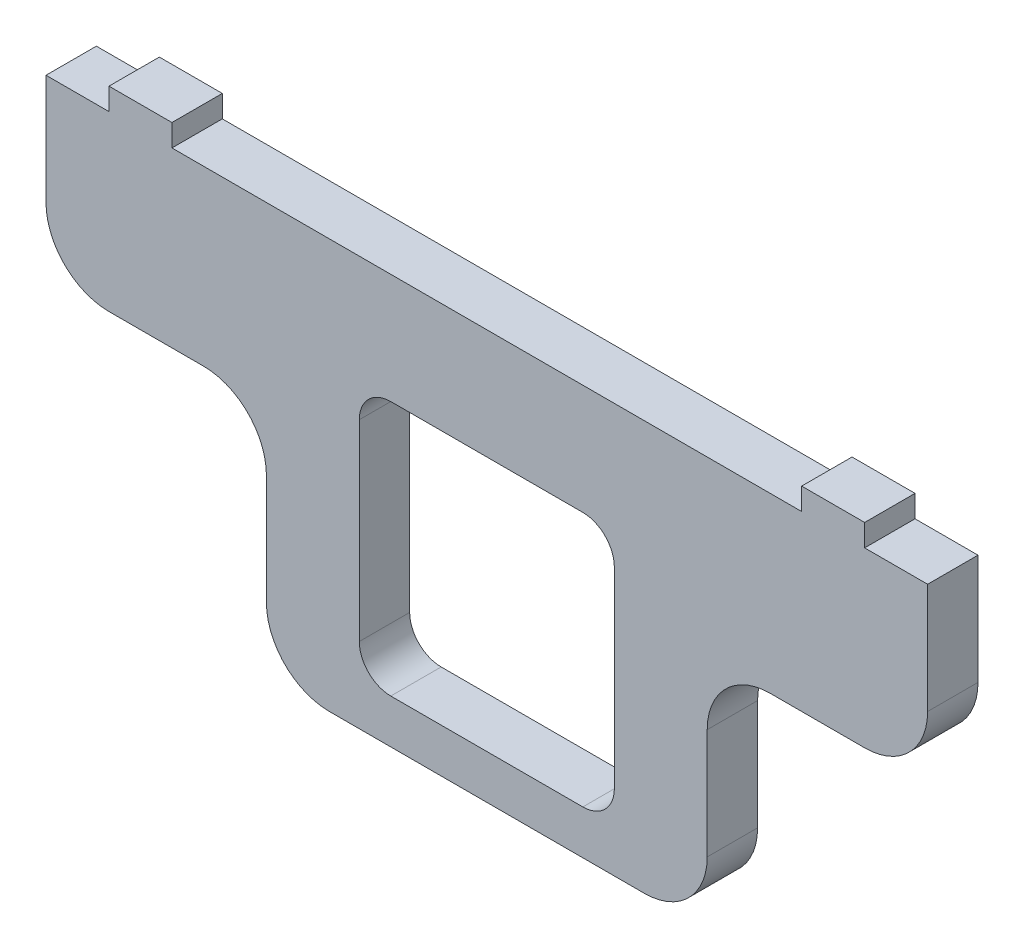
ISO-10303-21;
HEADER;
FILE_DESCRIPTION(('STEP AP214'),'2;1');
FILE_NAME('part.step','',(''),(''),'','','');
FILE_SCHEMA(('AUTOMOTIVE_DESIGN { 1 0 10303 214 1 1 1 1 }'));
ENDSEC;
DATA;
#1=APPLICATION_CONTEXT('core data for automotive mechanical design processes');
#2=APPLICATION_PROTOCOL_DEFINITION('international standard','automotive_design',2000,#1);
#3=PRODUCT_CONTEXT('',#1,'mechanical');
#4=PRODUCT('Part','Part','',(#3));
#5=PRODUCT_RELATED_PRODUCT_CATEGORY('part','',(#4));
#6=PRODUCT_DEFINITION_FORMATION('','',#4);
#7=PRODUCT_DEFINITION_CONTEXT('part definition',#1,'design');
#8=PRODUCT_DEFINITION('design','',#6,#7);
#9=PRODUCT_DEFINITION_SHAPE('','',#8);
#10=(LENGTH_UNIT() NAMED_UNIT(*) SI_UNIT(.MILLI.,.METRE.));
#11=(NAMED_UNIT(*) PLANE_ANGLE_UNIT() SI_UNIT($,.RADIAN.));
#12=(NAMED_UNIT(*) SI_UNIT($,.STERADIAN.) SOLID_ANGLE_UNIT());
#13=UNCERTAINTY_MEASURE_WITH_UNIT(LENGTH_MEASURE(1.E-05),#10,'distance_accuracy_value','');
#14=(GEOMETRIC_REPRESENTATION_CONTEXT(3) GLOBAL_UNCERTAINTY_ASSIGNED_CONTEXT((#13)) GLOBAL_UNIT_ASSIGNED_CONTEXT((#10,
#11,#12)) REPRESENTATION_CONTEXT('',''));
#15=CARTESIAN_POINT('',(0.,0.,0.));
#16=DIRECTION('',(0.,0.,1.));
#17=DIRECTION('',(1.,0.,0.));
#18=AXIS2_PLACEMENT_3D('',#15,#16,#17);
#19=CARTESIAN_POINT('',(0.,0.,8.));
#20=DIRECTION('',(0.,0.,-1.));
#21=DIRECTION('',(-1.,0.,0.));
#22=AXIS2_PLACEMENT_3D('',#19,#20,#21);
#23=PLANE('',#22);
#24=DIRECTION('',(1.,0.,0.));
#25=VECTOR('',#24,1.);
#26=CARTESIAN_POINT('',(70.,75.,8.));
#27=LINE('',#26,#25);
#28=CARTESIAN_POINT('',(90.,75.,8.));
#29=VERTEX_POINT('',#28);
#30=CARTESIAN_POINT('',(120.,75.,8.));
#31=VERTEX_POINT('',#30);
#32=EDGE_CURVE('E241',#29,#31,#27,.T.);
#33=ORIENTED_EDGE('',*,*,#32,.T.);
#34=CARTESIAN_POINT('',(120.,95.,8.));
#35=DIRECTION('',(0.,0.,-1.));
#36=DIRECTION('',(-1.,0.,0.));
#37=AXIS2_PLACEMENT_3D('',#34,#35,#36);
#38=CIRCLE('',#37,20.);
#39=CARTESIAN_POINT('',(140.,95.,8.));
#40=VERTEX_POINT('',#39);
#41=EDGE_CURVE('E237',#31,#40,#38,.F.);
#42=ORIENTED_EDGE('',*,*,#41,.T.);
#43=DIRECTION('',(0.,1.,0.));
#44=VECTOR('',#43,1.);
#45=CARTESIAN_POINT('',(140.,75.,8.));
#46=LINE('',#45,#44);
#47=CARTESIAN_POINT('',(140.,130.,8.));
#48=VERTEX_POINT('',#47);
#49=EDGE_CURVE('E230',#40,#48,#46,.T.);
#50=ORIENTED_EDGE('',*,*,#49,.T.);
#51=DIRECTION('',(-1.,0.,0.));
#52=VECTOR('',#51,1.);
#53=CARTESIAN_POINT('',(140.,130.,8.));
#54=LINE('',#53,#52);
#55=CARTESIAN_POINT('',(120.,130.,8.));
#56=VERTEX_POINT('',#55);
#57=EDGE_CURVE('E234',#48,#56,#54,.T.);
#58=ORIENTED_EDGE('',*,*,#57,.T.);
#59=DIRECTION('',(0.,1.,0.));
#60=VECTOR('',#59,1.);
#61=CARTESIAN_POINT('',(120.,130.,8.));
#62=LINE('',#61,#60);
#63=CARTESIAN_POINT('',(120.,137.,8.));
#64=VERTEX_POINT('',#63);
#65=EDGE_CURVE('E256',#56,#64,#62,.T.);
#66=ORIENTED_EDGE('',*,*,#65,.T.);
#67=DIRECTION('',(-1.,0.,0.));
#68=VECTOR('',#67,1.);
#69=CARTESIAN_POINT('',(120.,137.,8.));
#70=LINE('',#69,#68);
#71=CARTESIAN_POINT('',(100.,137.,8.));
#72=VERTEX_POINT('',#71);
#73=EDGE_CURVE('E258',#64,#72,#70,.T.);
#74=ORIENTED_EDGE('',*,*,#73,.T.);
#75=DIRECTION('',(0.,-1.,0.));
#76=VECTOR('',#75,1.);
#77=CARTESIAN_POINT('',(100.,137.,8.));
#78=LINE('',#77,#76);
#79=CARTESIAN_POINT('',(100.,130.,8.));
#80=VERTEX_POINT('',#79);
#81=EDGE_CURVE('E263',#72,#80,#78,.T.);
#82=ORIENTED_EDGE('',*,*,#81,.T.);
#83=DIRECTION('',(-1.,0.,0.));
#84=VECTOR('',#83,1.);
#85=CARTESIAN_POINT('',(100.,130.,8.));
#86=LINE('',#85,#84);
#87=CARTESIAN_POINT('',(-100.,130.,8.));
#88=VERTEX_POINT('',#87);
#89=EDGE_CURVE('E265',#80,#88,#86,.T.);
#90=ORIENTED_EDGE('',*,*,#89,.T.);
#91=DIRECTION('',(0.,1.,0.));
#92=VECTOR('',#91,1.);
#93=CARTESIAN_POINT('',(-100.,137.,8.));
#94=LINE('',#93,#92);
#95=CARTESIAN_POINT('',(-100.,137.,8.));
#96=VERTEX_POINT('',#95);
#97=EDGE_CURVE('E267',#88,#96,#94,.T.);
#98=ORIENTED_EDGE('',*,*,#97,.T.);
#99=DIRECTION('',(-1.,0.,0.));
#100=VECTOR('',#99,1.);
#101=CARTESIAN_POINT('',(-120.,137.,8.));
#102=LINE('',#101,#100);
#103=CARTESIAN_POINT('',(-120.,137.,8.));
#104=VERTEX_POINT('',#103);
#105=EDGE_CURVE('E269',#96,#104,#102,.T.);
#106=ORIENTED_EDGE('',*,*,#105,.T.);
#107=DIRECTION('',(0.,-1.,0.));
#108=VECTOR('',#107,1.);
#109=CARTESIAN_POINT('',(-120.,130.,8.));
#110=LINE('',#109,#108);
#111=CARTESIAN_POINT('',(-120.,130.,8.));
#112=VERTEX_POINT('',#111);
#113=EDGE_CURVE('E271',#104,#112,#110,.T.);
#114=ORIENTED_EDGE('',*,*,#113,.T.);
#115=DIRECTION('',(-1.,0.,0.));
#116=VECTOR('',#115,1.);
#117=CARTESIAN_POINT('',(-140.,130.,8.));
#118=LINE('',#117,#116);
#119=CARTESIAN_POINT('',(-140.,130.,8.));
#120=VERTEX_POINT('',#119);
#121=EDGE_CURVE('E273',#112,#120,#118,.T.);
#122=ORIENTED_EDGE('',*,*,#121,.T.);
#123=DIRECTION('',(0.,-1.,0.));
#124=VECTOR('',#123,1.);
#125=CARTESIAN_POINT('',(-140.,75.,8.));
#126=LINE('',#125,#124);
#127=CARTESIAN_POINT('',(-140.,95.,8.));
#128=VERTEX_POINT('',#127);
#129=EDGE_CURVE('E275',#120,#128,#126,.T.);
#130=ORIENTED_EDGE('',*,*,#129,.T.);
#131=CARTESIAN_POINT('',(-120.,95.,8.));
#132=DIRECTION('',(0.,0.,-1.));
#133=DIRECTION('',(-1.,0.,0.));
#134=AXIS2_PLACEMENT_3D('',#131,#132,#133);
#135=CIRCLE('',#134,20.);
#136=CARTESIAN_POINT('',(-120.,75.,8.));
#137=VERTEX_POINT('',#136);
#138=EDGE_CURVE('E369',#128,#137,#135,.F.);
#139=ORIENTED_EDGE('',*,*,#138,.T.);
#140=DIRECTION('',(1.,0.,0.));
#141=VECTOR('',#140,1.);
#142=CARTESIAN_POINT('',(-70.,75.,8.));
#143=LINE('',#142,#141);
#144=CARTESIAN_POINT('',(-90.,75.,8.));
#145=VERTEX_POINT('',#144);
#146=EDGE_CURVE('E278',#137,#145,#143,.T.);
#147=ORIENTED_EDGE('',*,*,#146,.T.);
#148=CARTESIAN_POINT('',(-90.,55.,8.));
#149=DIRECTION('',(0.,0.,-1.));
#150=DIRECTION('',(-1.,0.,0.));
#151=AXIS2_PLACEMENT_3D('',#148,#149,#150);
#152=CIRCLE('',#151,20.);
#153=CARTESIAN_POINT('',(-70.,55.,8.));
#154=VERTEX_POINT('',#153);
#155=EDGE_CURVE('E400',#145,#154,#152,.T.);
#156=ORIENTED_EDGE('',*,*,#155,.T.);
#157=DIRECTION('',(0.,-1.,0.));
#158=VECTOR('',#157,1.);
#159=CARTESIAN_POINT('',(-70.,0.,8.));
#160=LINE('',#159,#158);
#161=CARTESIAN_POINT('',(-70.,20.,8.));
#162=VERTEX_POINT('',#161);
#163=EDGE_CURVE('E281',#154,#162,#160,.T.);
#164=ORIENTED_EDGE('',*,*,#163,.T.);
#165=CARTESIAN_POINT('',(-50.,20.,8.));
#166=DIRECTION('',(0.,0.,-1.));
#167=DIRECTION('',(-1.,0.,0.));
#168=AXIS2_PLACEMENT_3D('',#165,#166,#167);
#169=CIRCLE('',#168,20.);
#170=CARTESIAN_POINT('',(-50.,0.,8.));
#171=VERTEX_POINT('',#170);
#172=EDGE_CURVE('E365',#162,#171,#169,.F.);
#173=ORIENTED_EDGE('',*,*,#172,.T.);
#174=DIRECTION('',(1.,0.,0.));
#175=VECTOR('',#174,1.);
#176=CARTESIAN_POINT('',(-70.,0.,8.));
#177=LINE('',#176,#175);
#178=CARTESIAN_POINT('',(50.,0.,8.));
#179=VERTEX_POINT('',#178);
#180=EDGE_CURVE('E284',#171,#179,#177,.T.);
#181=ORIENTED_EDGE('',*,*,#180,.T.);
#182=CARTESIAN_POINT('',(50.,20.,8.));
#183=DIRECTION('',(0.,0.,-1.));
#184=DIRECTION('',(-1.,0.,0.));
#185=AXIS2_PLACEMENT_3D('',#182,#183,#184);
#186=CIRCLE('',#185,20.);
#187=CARTESIAN_POINT('',(70.,20.,8.));
#188=VERTEX_POINT('',#187);
#189=EDGE_CURVE('E367',#179,#188,#186,.F.);
#190=ORIENTED_EDGE('',*,*,#189,.T.);
#191=DIRECTION('',(0.,1.,0.));
#192=VECTOR('',#191,1.);
#193=CARTESIAN_POINT('',(70.,0.,8.));
#194=LINE('',#193,#192);
#195=CARTESIAN_POINT('',(70.,55.,8.));
#196=VERTEX_POINT('',#195);
#197=EDGE_CURVE('E326',#188,#196,#194,.T.);
#198=ORIENTED_EDGE('',*,*,#197,.T.);
#199=CARTESIAN_POINT('',(90.,55.,8.));
#200=DIRECTION('',(0.,0.,-1.));
#201=DIRECTION('',(-1.,0.,0.));
#202=AXIS2_PLACEMENT_3D('',#199,#200,#201);
#203=CIRCLE('',#202,20.);
#204=EDGE_CURVE('E396',#196,#29,#203,.T.);
#205=ORIENTED_EDGE('',*,*,#204,.T.);
#206=EDGE_LOOP('',(#33,#42,#50,#58,#66,#74,#82,#90,#98,#106,#114,#122,#130,#139,#147,#156,#164,
#173,#181,#190,#198,#205));
#207=FACE_BOUND('',#206,.T.);
#208=DIRECTION('',(0.,-1.,0.));
#209=VECTOR('',#208,1.);
#210=CARTESIAN_POINT('',(-40.5,95.,8.));
#211=LINE('',#210,#209);
#212=CARTESIAN_POINT('',(-40.5,85.,8.));
#213=VERTEX_POINT('',#212);
#214=CARTESIAN_POINT('',(-40.5,24.,8.));
#215=VERTEX_POINT('',#214);
#216=EDGE_CURVE('E463',#213,#215,#211,.T.);
#217=ORIENTED_EDGE('',*,*,#216,.F.);
#218=CARTESIAN_POINT('',(-30.5,85.,8.));
#219=DIRECTION('',(0.,0.,-1.));
#220=DIRECTION('',(-1.,0.,0.));
#221=AXIS2_PLACEMENT_3D('',#218,#219,#220);
#222=CIRCLE('',#221,10.);
#223=CARTESIAN_POINT('',(-30.5,95.,8.));
#224=VERTEX_POINT('',#223);
#225=EDGE_CURVE('E11',#213,#224,#222,.T.);
#226=ORIENTED_EDGE('',*,*,#225,.T.);
#227=DIRECTION('',(-1.,0.,0.));
#228=VECTOR('',#227,1.);
#229=CARTESIAN_POINT('',(-40.5,95.,8.));
#230=LINE('',#229,#228);
#231=CARTESIAN_POINT('',(30.5,95.,8.));
#232=VERTEX_POINT('',#231);
#233=EDGE_CURVE('E292',#232,#224,#230,.T.);
#234=ORIENTED_EDGE('',*,*,#233,.F.);
#235=CARTESIAN_POINT('',(30.5,85.,8.));
#236=DIRECTION('',(0.,0.,-1.));
#237=DIRECTION('',(-1.,0.,0.));
#238=AXIS2_PLACEMENT_3D('',#235,#236,#237);
#239=CIRCLE('',#238,10.);
#240=CARTESIAN_POINT('',(40.5,85.,8.));
#241=VERTEX_POINT('',#240);
#242=EDGE_CURVE('E431',#232,#241,#239,.T.);
#243=ORIENTED_EDGE('',*,*,#242,.T.);
#244=DIRECTION('',(0.,1.,0.));
#245=VECTOR('',#244,1.);
#246=CARTESIAN_POINT('',(40.5,95.,8.));
#247=LINE('',#246,#245);
#248=CARTESIAN_POINT('',(40.5,24.,8.));
#249=VERTEX_POINT('',#248);
#250=EDGE_CURVE('E451',#249,#241,#247,.T.);
#251=ORIENTED_EDGE('',*,*,#250,.F.);
#252=CARTESIAN_POINT('',(30.5,24.,8.));
#253=DIRECTION('',(0.,0.,-1.));
#254=DIRECTION('',(-1.,0.,0.));
#255=AXIS2_PLACEMENT_3D('',#252,#253,#254);
#256=CIRCLE('',#255,10.);
#257=CARTESIAN_POINT('',(30.5,14.,8.));
#258=VERTEX_POINT('',#257);
#259=EDGE_CURVE('E423',#249,#258,#256,.T.);
#260=ORIENTED_EDGE('',*,*,#259,.T.);
#261=DIRECTION('',(1.,0.,0.));
#262=VECTOR('',#261,1.);
#263=CARTESIAN_POINT('',(40.5,14.,8.));
#264=LINE('',#263,#262);
#265=CARTESIAN_POINT('',(-30.5,14.,8.));
#266=VERTEX_POINT('',#265);
#267=EDGE_CURVE('E454',#266,#258,#264,.T.);
#268=ORIENTED_EDGE('',*,*,#267,.F.);
#269=CARTESIAN_POINT('',(-30.5,24.,8.));
#270=DIRECTION('',(0.,0.,-1.));
#271=DIRECTION('',(-1.,0.,0.));
#272=AXIS2_PLACEMENT_3D('',#269,#270,#271);
#273=CIRCLE('',#272,10.);
#274=EDGE_CURVE('E427',#266,#215,#273,.T.);
#275=ORIENTED_EDGE('',*,*,#274,.T.);
#276=EDGE_LOOP('',(#217,#226,#234,#243,#251,#260,#268,#275));
#277=FACE_BOUND('',#276,.T.);
#278=ADVANCED_FACE('F34',(#207,#277),#23,.F.);
#279=CARTESIAN_POINT('',(0.,0.,-8.));
#280=DIRECTION('',(0.,0.,-1.));
#281=DIRECTION('',(-1.,0.,0.));
#282=AXIS2_PLACEMENT_3D('',#279,#280,#281);
#283=PLANE('',#282);
#284=DIRECTION('',(0.,1.,0.));
#285=VECTOR('',#284,1.);
#286=CARTESIAN_POINT('',(140.,75.,-8.));
#287=LINE('',#286,#285);
#288=CARTESIAN_POINT('',(140.,95.,-8.));
#289=VERTEX_POINT('',#288);
#290=CARTESIAN_POINT('',(140.,130.,-8.));
#291=VERTEX_POINT('',#290);
#292=EDGE_CURVE('E247',#289,#291,#287,.T.);
#293=ORIENTED_EDGE('',*,*,#292,.F.);
#294=CARTESIAN_POINT('',(120.,95.,-8.));
#295=DIRECTION('',(0.,0.,-1.));
#296=DIRECTION('',(-1.,0.,0.));
#297=AXIS2_PLACEMENT_3D('',#294,#295,#296);
#298=CIRCLE('',#297,20.);
#299=CARTESIAN_POINT('',(120.,75.,-8.));
#300=VERTEX_POINT('',#299);
#301=EDGE_CURVE('E358',#289,#300,#298,.T.);
#302=ORIENTED_EDGE('',*,*,#301,.T.);
#303=DIRECTION('',(1.,0.,0.));
#304=VECTOR('',#303,1.);
#305=CARTESIAN_POINT('',(70.,75.,-8.));
#306=LINE('',#305,#304);
#307=CARTESIAN_POINT('',(90.,75.,-8.));
#308=VERTEX_POINT('',#307);
#309=EDGE_CURVE('E291',#308,#300,#306,.T.);
#310=ORIENTED_EDGE('',*,*,#309,.F.);
#311=CARTESIAN_POINT('',(90.,55.,-8.));
#312=DIRECTION('',(0.,0.,-1.));
#313=DIRECTION('',(-1.,0.,0.));
#314=AXIS2_PLACEMENT_3D('',#311,#312,#313);
#315=CIRCLE('',#314,20.);
#316=CARTESIAN_POINT('',(70.,55.,-8.));
#317=VERTEX_POINT('',#316);
#318=EDGE_CURVE('E394',#308,#317,#315,.F.);
#319=ORIENTED_EDGE('',*,*,#318,.T.);
#320=DIRECTION('',(0.,1.,0.));
#321=VECTOR('',#320,1.);
#322=CARTESIAN_POINT('',(70.,0.,-8.));
#323=LINE('',#322,#321);
#324=CARTESIAN_POINT('',(70.,20.,-8.));
#325=VERTEX_POINT('',#324);
#326=EDGE_CURVE('E288',#325,#317,#323,.T.);
#327=ORIENTED_EDGE('',*,*,#326,.F.);
#328=CARTESIAN_POINT('',(50.,20.,-8.));
#329=DIRECTION('',(0.,0.,-1.));
#330=DIRECTION('',(-1.,0.,0.));
#331=AXIS2_PLACEMENT_3D('',#328,#329,#330);
#332=CIRCLE('',#331,20.);
#333=CARTESIAN_POINT('',(50.,0.,-8.));
#334=VERTEX_POINT('',#333);
#335=EDGE_CURVE('E354',#325,#334,#332,.T.);
#336=ORIENTED_EDGE('',*,*,#335,.T.);
#337=DIRECTION('',(1.,0.,0.));
#338=VECTOR('',#337,1.);
#339=CARTESIAN_POINT('',(-70.,0.,-8.));
#340=LINE('',#339,#338);
#341=CARTESIAN_POINT('',(-50.,0.,-8.));
#342=VERTEX_POINT('',#341);
#343=EDGE_CURVE('E323',#342,#334,#340,.T.);
#344=ORIENTED_EDGE('',*,*,#343,.F.);
#345=CARTESIAN_POINT('',(-50.,20.,-8.));
#346=DIRECTION('',(0.,0.,-1.));
#347=DIRECTION('',(-1.,0.,0.));
#348=AXIS2_PLACEMENT_3D('',#345,#346,#347);
#349=CIRCLE('',#348,20.);
#350=CARTESIAN_POINT('',(-70.,20.,-8.));
#351=VERTEX_POINT('',#350);
#352=EDGE_CURVE('E352',#342,#351,#349,.T.);
#353=ORIENTED_EDGE('',*,*,#352,.T.);
#354=DIRECTION('',(0.,-1.,0.));
#355=VECTOR('',#354,1.);
#356=CARTESIAN_POINT('',(-70.,0.,-8.));
#357=LINE('',#356,#355);
#358=CARTESIAN_POINT('',(-70.,55.,-8.));
#359=VERTEX_POINT('',#358);
#360=EDGE_CURVE('E320',#359,#351,#357,.T.);
#361=ORIENTED_EDGE('',*,*,#360,.F.);
#362=CARTESIAN_POINT('',(-90.,55.,-8.));
#363=DIRECTION('',(0.,0.,-1.));
#364=DIRECTION('',(-1.,0.,0.));
#365=AXIS2_PLACEMENT_3D('',#362,#363,#364);
#366=CIRCLE('',#365,20.);
#367=CARTESIAN_POINT('',(-90.,75.,-8.));
#368=VERTEX_POINT('',#367);
#369=EDGE_CURVE('E398',#359,#368,#366,.F.);
#370=ORIENTED_EDGE('',*,*,#369,.T.);
#371=DIRECTION('',(1.,0.,0.));
#372=VECTOR('',#371,1.);
#373=CARTESIAN_POINT('',(-70.,75.,-8.));
#374=LINE('',#373,#372);
#375=CARTESIAN_POINT('',(-120.,75.,-8.));
#376=VERTEX_POINT('',#375);
#377=EDGE_CURVE('E317',#376,#368,#374,.T.);
#378=ORIENTED_EDGE('',*,*,#377,.F.);
#379=CARTESIAN_POINT('',(-120.,95.,-8.));
#380=DIRECTION('',(0.,0.,-1.));
#381=DIRECTION('',(-1.,0.,0.));
#382=AXIS2_PLACEMENT_3D('',#379,#380,#381);
#383=CIRCLE('',#382,20.);
#384=CARTESIAN_POINT('',(-140.,95.,-8.));
#385=VERTEX_POINT('',#384);
#386=EDGE_CURVE('E356',#376,#385,#383,.T.);
#387=ORIENTED_EDGE('',*,*,#386,.T.);
#388=DIRECTION('',(0.,-1.,0.));
#389=VECTOR('',#388,1.);
#390=CARTESIAN_POINT('',(-140.,75.,-8.));
#391=LINE('',#390,#389);
#392=CARTESIAN_POINT('',(-140.,130.,-8.));
#393=VERTEX_POINT('',#392);
#394=EDGE_CURVE('E314',#393,#385,#391,.T.);
#395=ORIENTED_EDGE('',*,*,#394,.F.);
#396=DIRECTION('',(-1.,0.,0.));
#397=VECTOR('',#396,1.);
#398=CARTESIAN_POINT('',(-140.,130.,-8.));
#399=LINE('',#398,#397);
#400=CARTESIAN_POINT('',(-120.,130.,-8.));
#401=VERTEX_POINT('',#400);
#402=EDGE_CURVE('E312',#401,#393,#399,.T.);
#403=ORIENTED_EDGE('',*,*,#402,.F.);
#404=DIRECTION('',(0.,-1.,0.));
#405=VECTOR('',#404,1.);
#406=CARTESIAN_POINT('',(-120.,130.,-8.));
#407=LINE('',#406,#405);
#408=CARTESIAN_POINT('',(-120.,137.,-8.));
#409=VERTEX_POINT('',#408);
#410=EDGE_CURVE('E310',#409,#401,#407,.T.);
#411=ORIENTED_EDGE('',*,*,#410,.F.);
#412=DIRECTION('',(-1.,0.,0.));
#413=VECTOR('',#412,1.);
#414=CARTESIAN_POINT('',(-120.,137.,-8.));
#415=LINE('',#414,#413);
#416=CARTESIAN_POINT('',(-100.,137.,-8.));
#417=VERTEX_POINT('',#416);
#418=EDGE_CURVE('E308',#417,#409,#415,.T.);
#419=ORIENTED_EDGE('',*,*,#418,.F.);
#420=DIRECTION('',(0.,1.,0.));
#421=VECTOR('',#420,1.);
#422=CARTESIAN_POINT('',(-100.,137.,-8.));
#423=LINE('',#422,#421);
#424=CARTESIAN_POINT('',(-100.,130.,-8.));
#425=VERTEX_POINT('',#424);
#426=EDGE_CURVE('E306',#425,#417,#423,.T.);
#427=ORIENTED_EDGE('',*,*,#426,.F.);
#428=DIRECTION('',(-1.,0.,0.));
#429=VECTOR('',#428,1.);
#430=CARTESIAN_POINT('',(100.,130.,-8.));
#431=LINE('',#430,#429);
#432=CARTESIAN_POINT('',(100.,130.,-8.));
#433=VERTEX_POINT('',#432);
#434=EDGE_CURVE('E304',#433,#425,#431,.T.);
#435=ORIENTED_EDGE('',*,*,#434,.F.);
#436=DIRECTION('',(0.,-1.,0.));
#437=VECTOR('',#436,1.);
#438=CARTESIAN_POINT('',(100.,137.,-8.));
#439=LINE('',#438,#437);
#440=CARTESIAN_POINT('',(100.,137.,-8.));
#441=VERTEX_POINT('',#440);
#442=EDGE_CURVE('E302',#441,#433,#439,.T.);
#443=ORIENTED_EDGE('',*,*,#442,.F.);
#444=DIRECTION('',(-1.,0.,0.));
#445=VECTOR('',#444,1.);
#446=CARTESIAN_POINT('',(120.,137.,-8.));
#447=LINE('',#446,#445);
#448=CARTESIAN_POINT('',(120.,137.,-8.));
#449=VERTEX_POINT('',#448);
#450=EDGE_CURVE('E300',#449,#441,#447,.T.);
#451=ORIENTED_EDGE('',*,*,#450,.F.);
#452=DIRECTION('',(0.,1.,0.));
#453=VECTOR('',#452,1.);
#454=CARTESIAN_POINT('',(120.,130.,-8.));
#455=LINE('',#454,#453);
#456=CARTESIAN_POINT('',(120.,130.,-8.));
#457=VERTEX_POINT('',#456);
#458=EDGE_CURVE('E298',#457,#449,#455,.T.);
#459=ORIENTED_EDGE('',*,*,#458,.F.);
#460=DIRECTION('',(-1.,0.,0.));
#461=VECTOR('',#460,1.);
#462=CARTESIAN_POINT('',(140.,130.,-8.));
#463=LINE('',#462,#461);
#464=EDGE_CURVE('E296',#291,#457,#463,.T.);
#465=ORIENTED_EDGE('',*,*,#464,.F.);
#466=EDGE_LOOP('',(#293,#302,#310,#319,#327,#336,#344,#353,#361,#370,#378,#387,#395,#403,#411,
#419,#427,#435,#443,#451,#459,#465));
#467=FACE_BOUND('',#466,.T.);
#468=DIRECTION('',(0.,1.,0.));
#469=VECTOR('',#468,1.);
#470=CARTESIAN_POINT('',(40.5,95.,-8.));
#471=LINE('',#470,#469);
#472=CARTESIAN_POINT('',(40.5,24.,-8.));
#473=VERTEX_POINT('',#472);
#474=CARTESIAN_POINT('',(40.5,85.,-8.));
#475=VERTEX_POINT('',#474);
#476=EDGE_CURVE('E460',#473,#475,#471,.T.);
#477=ORIENTED_EDGE('',*,*,#476,.T.);
#478=CARTESIAN_POINT('',(30.5,85.,-8.));
#479=DIRECTION('',(0.,0.,-1.));
#480=DIRECTION('',(-1.,0.,0.));
#481=AXIS2_PLACEMENT_3D('',#478,#479,#480);
#482=CIRCLE('',#481,10.);
#483=CARTESIAN_POINT('',(30.5,95.,-8.));
#484=VERTEX_POINT('',#483);
#485=EDGE_CURVE('E429',#475,#484,#482,.F.);
#486=ORIENTED_EDGE('',*,*,#485,.T.);
#487=DIRECTION('',(-1.,0.,0.));
#488=VECTOR('',#487,1.);
#489=CARTESIAN_POINT('',(-40.5,95.,-8.));
#490=LINE('',#489,#488);
#491=CARTESIAN_POINT('',(-30.5,95.,-8.));
#492=VERTEX_POINT('',#491);
#493=EDGE_CURVE('E439',#484,#492,#490,.T.);
#494=ORIENTED_EDGE('',*,*,#493,.T.);
#495=CARTESIAN_POINT('',(-30.5,85.,-8.));
#496=DIRECTION('',(0.,0.,-1.));
#497=DIRECTION('',(-1.,0.,0.));
#498=AXIS2_PLACEMENT_3D('',#495,#496,#497);
#499=CIRCLE('',#498,10.);
#500=CARTESIAN_POINT('',(-40.5,85.,-8.));
#501=VERTEX_POINT('',#500);
#502=EDGE_CURVE('E42',#492,#501,#499,.F.);
#503=ORIENTED_EDGE('',*,*,#502,.T.);
#504=DIRECTION('',(0.,-1.,0.));
#505=VECTOR('',#504,1.);
#506=CARTESIAN_POINT('',(-40.5,95.,-8.));
#507=LINE('',#506,#505);
#508=CARTESIAN_POINT('',(-40.5,24.,-8.));
#509=VERTEX_POINT('',#508);
#510=EDGE_CURVE('E438',#501,#509,#507,.T.);
#511=ORIENTED_EDGE('',*,*,#510,.T.);
#512=CARTESIAN_POINT('',(-30.5,24.,-8.));
#513=DIRECTION('',(0.,0.,-1.));
#514=DIRECTION('',(-1.,0.,0.));
#515=AXIS2_PLACEMENT_3D('',#512,#513,#514);
#516=CIRCLE('',#515,10.);
#517=CARTESIAN_POINT('',(-30.5,14.,-8.));
#518=VERTEX_POINT('',#517);
#519=EDGE_CURVE('E425',#509,#518,#516,.F.);
#520=ORIENTED_EDGE('',*,*,#519,.T.);
#521=DIRECTION('',(1.,0.,0.));
#522=VECTOR('',#521,1.);
#523=CARTESIAN_POINT('',(40.5,14.,-8.));
#524=LINE('',#523,#522);
#525=CARTESIAN_POINT('',(30.5,14.,-8.));
#526=VERTEX_POINT('',#525);
#527=EDGE_CURVE('E447',#518,#526,#524,.T.);
#528=ORIENTED_EDGE('',*,*,#527,.T.);
#529=CARTESIAN_POINT('',(30.5,24.,-8.));
#530=DIRECTION('',(0.,0.,-1.));
#531=DIRECTION('',(-1.,0.,0.));
#532=AXIS2_PLACEMENT_3D('',#529,#530,#531);
#533=CIRCLE('',#532,10.);
#534=EDGE_CURVE('E421',#526,#473,#533,.F.);
#535=ORIENTED_EDGE('',*,*,#534,.T.);
#536=EDGE_LOOP('',(#477,#486,#494,#503,#511,#520,#528,#535));
#537=FACE_BOUND('',#536,.T.);
#538=ADVANCED_FACE('F437',(#467,#537),#283,.T.);
#539=CARTESIAN_POINT('',(70.,0.,8.));
#540=DIRECTION('',(-1.,0.,0.));
#541=DIRECTION('',(0.,-1.,0.));
#542=AXIS2_PLACEMENT_3D('',#539,#540,#541);
#543=PLANE('',#542);
#544=ORIENTED_EDGE('',*,*,#197,.F.);
#545=DIRECTION('',(0.,0.,-1.));
#546=VECTOR('',#545,1.);
#547=CARTESIAN_POINT('',(70.,20.,8.));
#548=LINE('',#547,#546);
#549=EDGE_CURVE('E381',#188,#325,#548,.T.);
#550=ORIENTED_EDGE('',*,*,#549,.T.);
#551=ORIENTED_EDGE('',*,*,#326,.T.);
#552=DIRECTION('',(0.,0.,-1.));
#553=VECTOR('',#552,1.);
#554=CARTESIAN_POINT('',(70.,55.,8.));
#555=LINE('',#554,#553);
#556=EDGE_CURVE('E379',#317,#196,#555,.F.);
#557=ORIENTED_EDGE('',*,*,#556,.T.);
#558=EDGE_LOOP('',(#544,#550,#551,#557));
#559=FACE_BOUND('',#558,.T.);
#560=ADVANCED_FACE('F551',(#559),#543,.F.);
#561=CARTESIAN_POINT('',(70.,75.,8.));
#562=DIRECTION('',(0.,1.,0.));
#563=DIRECTION('',(0.,0.,1.));
#564=AXIS2_PLACEMENT_3D('',#561,#562,#563);
#565=PLANE('',#564);
#566=ORIENTED_EDGE('',*,*,#309,.T.);
#567=DIRECTION('',(0.,0.,-1.));
#568=VECTOR('',#567,1.);
#569=CARTESIAN_POINT('',(120.,75.,8.));
#570=LINE('',#569,#568);
#571=EDGE_CURVE('E363',#300,#31,#570,.F.);
#572=ORIENTED_EDGE('',*,*,#571,.T.);
#573=ORIENTED_EDGE('',*,*,#32,.F.);
#574=DIRECTION('',(0.,0.,-1.));
#575=VECTOR('',#574,1.);
#576=CARTESIAN_POINT('',(90.,75.,-8.));
#577=LINE('',#576,#575);
#578=EDGE_CURVE('E360',#29,#308,#577,.T.);
#579=ORIENTED_EDGE('',*,*,#578,.T.);
#580=EDGE_LOOP('',(#566,#572,#573,#579));
#581=FACE_BOUND('',#580,.T.);
#582=ADVANCED_FACE('F556',(#581),#565,.F.);
#583=CARTESIAN_POINT('',(140.,75.,8.));
#584=DIRECTION('',(-1.,0.,0.));
#585=DIRECTION('',(0.,0.,1.));
#586=AXIS2_PLACEMENT_3D('',#583,#584,#585);
#587=PLANE('',#586);
#588=ORIENTED_EDGE('',*,*,#49,.F.);
#589=DIRECTION('',(0.,0.,-1.));
#590=VECTOR('',#589,1.);
#591=CARTESIAN_POINT('',(140.,95.,8.));
#592=LINE('',#591,#590);
#593=EDGE_CURVE('E250',#40,#289,#592,.T.);
#594=ORIENTED_EDGE('',*,*,#593,.T.);
#595=ORIENTED_EDGE('',*,*,#292,.T.);
#596=DIRECTION('',(0.,0.,-1.));
#597=VECTOR('',#596,1.);
#598=CARTESIAN_POINT('',(140.,130.,8.));
#599=LINE('',#598,#597);
#600=EDGE_CURVE('E244',#48,#291,#599,.T.);
#601=ORIENTED_EDGE('',*,*,#600,.F.);
#602=EDGE_LOOP('',(#588,#594,#595,#601));
#603=FACE_BOUND('',#602,.T.);
#604=ADVANCED_FACE('F245',(#603),#587,.F.);
#605=CARTESIAN_POINT('',(140.,130.,8.));
#606=DIRECTION('',(0.,-1.,0.));
#607=DIRECTION('',(0.,0.,-1.));
#608=AXIS2_PLACEMENT_3D('',#605,#606,#607);
#609=PLANE('',#608);
#610=ORIENTED_EDGE('',*,*,#464,.T.);
#611=DIRECTION('',(0.,0.,-1.));
#612=VECTOR('',#611,1.);
#613=CARTESIAN_POINT('',(120.,130.,8.));
#614=LINE('',#613,#612);
#615=EDGE_CURVE('E251',#56,#457,#614,.T.);
#616=ORIENTED_EDGE('',*,*,#615,.F.);
#617=ORIENTED_EDGE('',*,*,#57,.F.);
#618=ORIENTED_EDGE('',*,*,#600,.T.);
#619=EDGE_LOOP('',(#610,#616,#617,#618));
#620=FACE_BOUND('',#619,.T.);
#621=ADVANCED_FACE('F253',(#620),#609,.F.);
#622=CARTESIAN_POINT('',(120.,130.,8.));
#623=DIRECTION('',(-1.,0.,0.));
#624=DIRECTION('',(0.,-1.,0.));
#625=AXIS2_PLACEMENT_3D('',#622,#623,#624);
#626=PLANE('',#625);
#627=ORIENTED_EDGE('',*,*,#458,.T.);
#628=DIRECTION('',(0.,0.,-1.));
#629=VECTOR('',#628,1.);
#630=CARTESIAN_POINT('',(120.,137.,8.));
#631=LINE('',#630,#629);
#632=EDGE_CURVE('E347',#64,#449,#631,.T.);
#633=ORIENTED_EDGE('',*,*,#632,.F.);
#634=ORIENTED_EDGE('',*,*,#65,.F.);
#635=ORIENTED_EDGE('',*,*,#615,.T.);
#636=EDGE_LOOP('',(#627,#633,#634,#635));
#637=FACE_BOUND('',#636,.T.);
#638=ADVANCED_FACE('F477',(#637),#626,.F.);
#639=CARTESIAN_POINT('',(120.,137.,8.));
#640=DIRECTION('',(0.,-1.,0.));
#641=DIRECTION('',(0.,0.,-1.));
#642=AXIS2_PLACEMENT_3D('',#639,#640,#641);
#643=PLANE('',#642);
#644=ORIENTED_EDGE('',*,*,#450,.T.);
#645=DIRECTION('',(0.,0.,-1.));
#646=VECTOR('',#645,1.);
#647=CARTESIAN_POINT('',(100.,137.,8.));
#648=LINE('',#647,#646);
#649=EDGE_CURVE('E344',#72,#441,#648,.T.);
#650=ORIENTED_EDGE('',*,*,#649,.F.);
#651=ORIENTED_EDGE('',*,*,#73,.F.);
#652=ORIENTED_EDGE('',*,*,#632,.T.);
#653=EDGE_LOOP('',(#644,#650,#651,#652));
#654=FACE_BOUND('',#653,.T.);
#655=ADVANCED_FACE('F484',(#654),#643,.F.);
#656=CARTESIAN_POINT('',(100.,137.,8.));
#657=DIRECTION('',(1.,0.,0.));
#658=DIRECTION('',(0.,0.,-1.));
#659=AXIS2_PLACEMENT_3D('',#656,#657,#658);
#660=PLANE('',#659);
#661=ORIENTED_EDGE('',*,*,#442,.T.);
#662=DIRECTION('',(0.,0.,-1.));
#663=VECTOR('',#662,1.);
#664=CARTESIAN_POINT('',(100.,130.,8.));
#665=LINE('',#664,#663);
#666=EDGE_CURVE('E341',#80,#433,#665,.T.);
#667=ORIENTED_EDGE('',*,*,#666,.F.);
#668=ORIENTED_EDGE('',*,*,#81,.F.);
#669=ORIENTED_EDGE('',*,*,#649,.T.);
#670=EDGE_LOOP('',(#661,#667,#668,#669));
#671=FACE_BOUND('',#670,.T.);
#672=ADVANCED_FACE('F487',(#671),#660,.F.);
#673=CARTESIAN_POINT('',(100.,130.,8.));
#674=DIRECTION('',(0.,-1.,0.));
#675=DIRECTION('',(0.,0.,-1.));
#676=AXIS2_PLACEMENT_3D('',#673,#674,#675);
#677=PLANE('',#676);
#678=ORIENTED_EDGE('',*,*,#434,.T.);
#679=DIRECTION('',(0.,0.,-1.));
#680=VECTOR('',#679,1.);
#681=CARTESIAN_POINT('',(-100.,130.,8.));
#682=LINE('',#681,#680);
#683=EDGE_CURVE('E338',#88,#425,#682,.T.);
#684=ORIENTED_EDGE('',*,*,#683,.F.);
#685=ORIENTED_EDGE('',*,*,#89,.F.);
#686=ORIENTED_EDGE('',*,*,#666,.T.);
#687=EDGE_LOOP('',(#678,#684,#685,#686));
#688=FACE_BOUND('',#687,.T.);
#689=ADVANCED_FACE('F492',(#688),#677,.F.);
#690=CARTESIAN_POINT('',(-100.,137.,8.));
#691=DIRECTION('',(-1.,0.,0.));
#692=DIRECTION('',(0.,0.,1.));
#693=AXIS2_PLACEMENT_3D('',#690,#691,#692);
#694=PLANE('',#693);
#695=ORIENTED_EDGE('',*,*,#426,.T.);
#696=DIRECTION('',(0.,0.,-1.));
#697=VECTOR('',#696,1.);
#698=CARTESIAN_POINT('',(-100.,137.,8.));
#699=LINE('',#698,#697);
#700=EDGE_CURVE('E335',#96,#417,#699,.T.);
#701=ORIENTED_EDGE('',*,*,#700,.F.);
#702=ORIENTED_EDGE('',*,*,#97,.F.);
#703=ORIENTED_EDGE('',*,*,#683,.T.);
#704=EDGE_LOOP('',(#695,#701,#702,#703));
#705=FACE_BOUND('',#704,.T.);
#706=ADVANCED_FACE('F498',(#705),#694,.F.);
#707=CARTESIAN_POINT('',(-120.,137.,8.));
#708=DIRECTION('',(0.,-1.,0.));
#709=DIRECTION('',(0.,0.,-1.));
#710=AXIS2_PLACEMENT_3D('',#707,#708,#709);
#711=PLANE('',#710);
#712=ORIENTED_EDGE('',*,*,#418,.T.);
#713=DIRECTION('',(0.,0.,-1.));
#714=VECTOR('',#713,1.);
#715=CARTESIAN_POINT('',(-120.,137.,8.));
#716=LINE('',#715,#714);
#717=EDGE_CURVE('E332',#104,#409,#716,.T.);
#718=ORIENTED_EDGE('',*,*,#717,.F.);
#719=ORIENTED_EDGE('',*,*,#105,.F.);
#720=ORIENTED_EDGE('',*,*,#700,.T.);
#721=EDGE_LOOP('',(#712,#718,#719,#720));
#722=FACE_BOUND('',#721,.T.);
#723=ADVANCED_FACE('F502',(#722),#711,.F.);
#724=CARTESIAN_POINT('',(-120.,130.,8.));
#725=DIRECTION('',(1.,0.,0.));
#726=DIRECTION('',(0.,1.,0.));
#727=AXIS2_PLACEMENT_3D('',#724,#725,#726);
#728=PLANE('',#727);
#729=ORIENTED_EDGE('',*,*,#410,.T.);
#730=DIRECTION('',(0.,0.,-1.));
#731=VECTOR('',#730,1.);
#732=CARTESIAN_POINT('',(-120.,130.,8.));
#733=LINE('',#732,#731);
#734=EDGE_CURVE('E329',#112,#401,#733,.T.);
#735=ORIENTED_EDGE('',*,*,#734,.F.);
#736=ORIENTED_EDGE('',*,*,#113,.F.);
#737=ORIENTED_EDGE('',*,*,#717,.T.);
#738=EDGE_LOOP('',(#729,#735,#736,#737));
#739=FACE_BOUND('',#738,.T.);
#740=ADVANCED_FACE('F507',(#739),#728,.F.);
#741=CARTESIAN_POINT('',(-140.,130.,8.));
#742=DIRECTION('',(0.,-1.,0.));
#743=DIRECTION('',(0.,0.,-1.));
#744=AXIS2_PLACEMENT_3D('',#741,#742,#743);
#745=PLANE('',#744);
#746=ORIENTED_EDGE('',*,*,#402,.T.);
#747=DIRECTION('',(0.,0.,-1.));
#748=VECTOR('',#747,1.);
#749=CARTESIAN_POINT('',(-140.,130.,8.));
#750=LINE('',#749,#748);
#751=EDGE_CURVE('E287',#120,#393,#750,.T.);
#752=ORIENTED_EDGE('',*,*,#751,.F.);
#753=ORIENTED_EDGE('',*,*,#121,.F.);
#754=ORIENTED_EDGE('',*,*,#734,.T.);
#755=EDGE_LOOP('',(#746,#752,#753,#754));
#756=FACE_BOUND('',#755,.T.);
#757=ADVANCED_FACE('F513',(#756),#745,.F.);
#758=CARTESIAN_POINT('',(-140.,75.,8.));
#759=DIRECTION('',(1.,0.,0.));
#760=DIRECTION('',(0.,0.,-1.));
#761=AXIS2_PLACEMENT_3D('',#758,#759,#760);
#762=PLANE('',#761);
#763=ORIENTED_EDGE('',*,*,#394,.T.);
#764=DIRECTION('',(0.,0.,-1.));
#765=VECTOR('',#764,1.);
#766=CARTESIAN_POINT('',(-140.,95.,8.));
#767=LINE('',#766,#765);
#768=EDGE_CURVE('E377',#385,#128,#767,.F.);
#769=ORIENTED_EDGE('',*,*,#768,.T.);
#770=ORIENTED_EDGE('',*,*,#129,.F.);
#771=ORIENTED_EDGE('',*,*,#751,.T.);
#772=EDGE_LOOP('',(#763,#769,#770,#771));
#773=FACE_BOUND('',#772,.T.);
#774=ADVANCED_FACE('F517',(#773),#762,.F.);
#775=CARTESIAN_POINT('',(-70.,75.,8.));
#776=DIRECTION('',(0.,1.,0.));
#777=DIRECTION('',(0.,0.,1.));
#778=AXIS2_PLACEMENT_3D('',#775,#776,#777);
#779=PLANE('',#778);
#780=ORIENTED_EDGE('',*,*,#146,.F.);
#781=DIRECTION('',(0.,0.,-1.));
#782=VECTOR('',#781,1.);
#783=CARTESIAN_POINT('',(-120.,75.,8.));
#784=LINE('',#783,#782);
#785=EDGE_CURVE('E374',#137,#376,#784,.T.);
#786=ORIENTED_EDGE('',*,*,#785,.T.);
#787=ORIENTED_EDGE('',*,*,#377,.T.);
#788=DIRECTION('',(0.,0.,-1.));
#789=VECTOR('',#788,1.);
#790=CARTESIAN_POINT('',(-90.,75.,8.));
#791=LINE('',#790,#789);
#792=EDGE_CURVE('E372',#368,#145,#791,.F.);
#793=ORIENTED_EDGE('',*,*,#792,.T.);
#794=EDGE_LOOP('',(#780,#786,#787,#793));
#795=FACE_BOUND('',#794,.T.);
#796=ADVANCED_FACE('F525',(#795),#779,.F.);
#797=CARTESIAN_POINT('',(-70.,0.,8.));
#798=DIRECTION('',(1.,0.,0.));
#799=DIRECTION('',(0.,1.,0.));
#800=AXIS2_PLACEMENT_3D('',#797,#798,#799);
#801=PLANE('',#800);
#802=ORIENTED_EDGE('',*,*,#360,.T.);
#803=DIRECTION('',(0.,0.,-1.));
#804=VECTOR('',#803,1.);
#805=CARTESIAN_POINT('',(-70.,20.,8.));
#806=LINE('',#805,#804);
#807=EDGE_CURVE('E392',#351,#162,#806,.F.);
#808=ORIENTED_EDGE('',*,*,#807,.T.);
#809=ORIENTED_EDGE('',*,*,#163,.F.);
#810=DIRECTION('',(0.,0.,-1.));
#811=VECTOR('',#810,1.);
#812=CARTESIAN_POINT('',(-70.,55.,-8.));
#813=LINE('',#812,#811);
#814=EDGE_CURVE('E389',#154,#359,#813,.T.);
#815=ORIENTED_EDGE('',*,*,#814,.T.);
#816=EDGE_LOOP('',(#802,#808,#809,#815));
#817=FACE_BOUND('',#816,.T.);
#818=ADVANCED_FACE('F534',(#817),#801,.F.);
#819=CARTESIAN_POINT('',(-70.,0.,8.));
#820=DIRECTION('',(0.,1.,0.));
#821=DIRECTION('',(0.,0.,1.));
#822=AXIS2_PLACEMENT_3D('',#819,#820,#821);
#823=PLANE('',#822);
#824=ORIENTED_EDGE('',*,*,#343,.T.);
#825=DIRECTION('',(0.,0.,-1.));
#826=VECTOR('',#825,1.);
#827=CARTESIAN_POINT('',(50.,0.,8.));
#828=LINE('',#827,#826);
#829=EDGE_CURVE('E387',#334,#179,#828,.F.);
#830=ORIENTED_EDGE('',*,*,#829,.T.);
#831=ORIENTED_EDGE('',*,*,#180,.F.);
#832=DIRECTION('',(0.,0.,-1.));
#833=VECTOR('',#832,1.);
#834=CARTESIAN_POINT('',(-50.,0.,8.));
#835=LINE('',#834,#833);
#836=EDGE_CURVE('E384',#171,#342,#835,.T.);
#837=ORIENTED_EDGE('',*,*,#836,.T.);
#838=EDGE_LOOP('',(#824,#830,#831,#837));
#839=FACE_BOUND('',#838,.T.);
#840=ADVANCED_FACE('F543',(#839),#823,.F.);
#841=CARTESIAN_POINT('',(-40.5,95.,8.));
#842=DIRECTION('',(1.,0.,0.));
#843=DIRECTION('',(0.,1.,0.));
#844=AXIS2_PLACEMENT_3D('',#841,#842,#843);
#845=PLANE('',#844);
#846=ORIENTED_EDGE('',*,*,#216,.T.);
#847=DIRECTION('',(0.,0.,-1.));
#848=VECTOR('',#847,1.);
#849=CARTESIAN_POINT('',(-40.5,24.,-8.));
#850=LINE('',#849,#848);
#851=EDGE_CURVE('E414',#215,#509,#850,.T.);
#852=ORIENTED_EDGE('',*,*,#851,.T.);
#853=ORIENTED_EDGE('',*,*,#510,.F.);
#854=DIRECTION('',(0.,0.,-1.));
#855=VECTOR('',#854,1.);
#856=CARTESIAN_POINT('',(-40.5,85.,8.));
#857=LINE('',#856,#855);
#858=EDGE_CURVE('E412',#501,#213,#857,.F.);
#859=ORIENTED_EDGE('',*,*,#858,.T.);
#860=EDGE_LOOP('',(#846,#852,#853,#859));
#861=FACE_BOUND('',#860,.T.);
#862=ADVANCED_FACE('F445',(#861),#845,.T.);
#863=CARTESIAN_POINT('',(40.5,14.,8.));
#864=DIRECTION('',(0.,1.,0.));
#865=DIRECTION('',(0.,0.,1.));
#866=AXIS2_PLACEMENT_3D('',#863,#864,#865);
#867=PLANE('',#866);
#868=ORIENTED_EDGE('',*,*,#267,.T.);
#869=DIRECTION('',(0.,0.,-1.));
#870=VECTOR('',#869,1.);
#871=CARTESIAN_POINT('',(30.5,14.,-8.));
#872=LINE('',#871,#870);
#873=EDGE_CURVE('E404',#258,#526,#872,.T.);
#874=ORIENTED_EDGE('',*,*,#873,.T.);
#875=ORIENTED_EDGE('',*,*,#527,.F.);
#876=DIRECTION('',(0.,0.,-1.));
#877=VECTOR('',#876,1.);
#878=CARTESIAN_POINT('',(-30.5,14.,8.));
#879=LINE('',#878,#877);
#880=EDGE_CURVE('E402',#518,#266,#879,.F.);
#881=ORIENTED_EDGE('',*,*,#880,.T.);
#882=EDGE_LOOP('',(#868,#874,#875,#881));
#883=FACE_BOUND('',#882,.T.);
#884=ADVANCED_FACE('F659',(#883),#867,.T.);
#885=CARTESIAN_POINT('',(40.5,95.,8.));
#886=DIRECTION('',(-1.,0.,0.));
#887=DIRECTION('',(0.,-1.,0.));
#888=AXIS2_PLACEMENT_3D('',#885,#886,#887);
#889=PLANE('',#888);
#890=ORIENTED_EDGE('',*,*,#476,.F.);
#891=DIRECTION('',(0.,0.,-1.));
#892=VECTOR('',#891,1.);
#893=CARTESIAN_POINT('',(40.5,24.,8.));
#894=LINE('',#893,#892);
#895=EDGE_CURVE('E410',#473,#249,#894,.F.);
#896=ORIENTED_EDGE('',*,*,#895,.T.);
#897=ORIENTED_EDGE('',*,*,#250,.T.);
#898=DIRECTION('',(0.,0.,-1.));
#899=VECTOR('',#898,1.);
#900=CARTESIAN_POINT('',(40.5,85.,-8.));
#901=LINE('',#900,#899);
#902=EDGE_CURVE('E407',#241,#475,#901,.T.);
#903=ORIENTED_EDGE('',*,*,#902,.T.);
#904=EDGE_LOOP('',(#890,#896,#897,#903));
#905=FACE_BOUND('',#904,.T.);
#906=ADVANCED_FACE('F666',(#905),#889,.T.);
#907=CARTESIAN_POINT('',(-40.5,95.,8.));
#908=DIRECTION('',(0.,-1.,0.));
#909=DIRECTION('',(0.,0.,-1.));
#910=AXIS2_PLACEMENT_3D('',#907,#908,#909);
#911=PLANE('',#910);
#912=ORIENTED_EDGE('',*,*,#493,.F.);
#913=DIRECTION('',(0.,0.,-1.));
#914=VECTOR('',#913,1.);
#915=CARTESIAN_POINT('',(30.5,95.,8.));
#916=LINE('',#915,#914);
#917=EDGE_CURVE('E54',#484,#232,#916,.F.);
#918=ORIENTED_EDGE('',*,*,#917,.T.);
#919=ORIENTED_EDGE('',*,*,#233,.T.);
#920=DIRECTION('',(0.,0.,-1.));
#921=VECTOR('',#920,1.);
#922=CARTESIAN_POINT('',(-30.5,95.,-8.));
#923=LINE('',#922,#921);
#924=EDGE_CURVE('E417',#224,#492,#923,.T.);
#925=ORIENTED_EDGE('',*,*,#924,.T.);
#926=EDGE_LOOP('',(#912,#918,#919,#925));
#927=FACE_BOUND('',#926,.T.);
#928=ADVANCED_FACE('F449',(#927),#911,.T.);
#929=CARTESIAN_POINT('',(120.,95.,8.));
#930=DIRECTION('',(0.,0.,-1.));
#931=DIRECTION('',(-1.,0.,0.));
#932=AXIS2_PLACEMENT_3D('',#929,#930,#931);
#933=CYLINDRICAL_SURFACE('',#932,20.);
#934=ORIENTED_EDGE('',*,*,#41,.F.);
#935=ORIENTED_EDGE('',*,*,#571,.F.);
#936=ORIENTED_EDGE('',*,*,#301,.F.);
#937=ORIENTED_EDGE('',*,*,#593,.F.);
#938=EDGE_LOOP('',(#934,#935,#936,#937));
#939=FACE_BOUND('',#938,.T.);
#940=ADVANCED_FACE('F471',(#939),#933,.T.);
#941=CARTESIAN_POINT('',(-120.,95.,8.));
#942=DIRECTION('',(0.,0.,-1.));
#943=DIRECTION('',(-1.,0.,0.));
#944=AXIS2_PLACEMENT_3D('',#941,#942,#943);
#945=CYLINDRICAL_SURFACE('',#944,20.);
#946=ORIENTED_EDGE('',*,*,#138,.F.);
#947=ORIENTED_EDGE('',*,*,#768,.F.);
#948=ORIENTED_EDGE('',*,*,#386,.F.);
#949=ORIENTED_EDGE('',*,*,#785,.F.);
#950=EDGE_LOOP('',(#946,#947,#948,#949));
#951=FACE_BOUND('',#950,.T.);
#952=ADVANCED_FACE('F520',(#951),#945,.T.);
#953=CARTESIAN_POINT('',(50.,20.,8.));
#954=DIRECTION('',(0.,0.,-1.));
#955=DIRECTION('',(-1.,0.,0.));
#956=AXIS2_PLACEMENT_3D('',#953,#954,#955);
#957=CYLINDRICAL_SURFACE('',#956,20.);
#958=ORIENTED_EDGE('',*,*,#189,.F.);
#959=ORIENTED_EDGE('',*,*,#829,.F.);
#960=ORIENTED_EDGE('',*,*,#335,.F.);
#961=ORIENTED_EDGE('',*,*,#549,.F.);
#962=EDGE_LOOP('',(#958,#959,#960,#961));
#963=FACE_BOUND('',#962,.T.);
#964=ADVANCED_FACE('F547',(#963),#957,.T.);
#965=CARTESIAN_POINT('',(-50.,20.,8.));
#966=DIRECTION('',(0.,0.,-1.));
#967=DIRECTION('',(-1.,0.,0.));
#968=AXIS2_PLACEMENT_3D('',#965,#966,#967);
#969=CYLINDRICAL_SURFACE('',#968,20.);
#970=ORIENTED_EDGE('',*,*,#172,.F.);
#971=ORIENTED_EDGE('',*,*,#807,.F.);
#972=ORIENTED_EDGE('',*,*,#352,.F.);
#973=ORIENTED_EDGE('',*,*,#836,.F.);
#974=EDGE_LOOP('',(#970,#971,#972,#973));
#975=FACE_BOUND('',#974,.T.);
#976=ADVANCED_FACE('F538',(#975),#969,.T.);
#977=CARTESIAN_POINT('',(90.,55.,8.));
#978=DIRECTION('',(0.,0.,1.));
#979=DIRECTION('',(1.,0.,0.));
#980=AXIS2_PLACEMENT_3D('',#977,#978,#979);
#981=CYLINDRICAL_SURFACE('',#980,20.);
#982=ORIENTED_EDGE('',*,*,#204,.F.);
#983=ORIENTED_EDGE('',*,*,#556,.F.);
#984=ORIENTED_EDGE('',*,*,#318,.F.);
#985=ORIENTED_EDGE('',*,*,#578,.F.);
#986=EDGE_LOOP('',(#982,#983,#984,#985));
#987=FACE_BOUND('',#986,.T.);
#988=ADVANCED_FACE('F555',(#987),#981,.F.);
#989=CARTESIAN_POINT('',(-90.,55.,8.));
#990=DIRECTION('',(0.,0.,1.));
#991=DIRECTION('',(1.,0.,0.));
#992=AXIS2_PLACEMENT_3D('',#989,#990,#991);
#993=CYLINDRICAL_SURFACE('',#992,20.);
#994=ORIENTED_EDGE('',*,*,#155,.F.);
#995=ORIENTED_EDGE('',*,*,#792,.F.);
#996=ORIENTED_EDGE('',*,*,#369,.F.);
#997=ORIENTED_EDGE('',*,*,#814,.F.);
#998=EDGE_LOOP('',(#994,#995,#996,#997));
#999=FACE_BOUND('',#998,.T.);
#1000=ADVANCED_FACE('F529',(#999),#993,.F.);
#1001=CARTESIAN_POINT('',(30.5,24.,8.));
#1002=DIRECTION('',(0.,0.,1.));
#1003=DIRECTION('',(1.,0.,0.));
#1004=AXIS2_PLACEMENT_3D('',#1001,#1002,#1003);
#1005=CYLINDRICAL_SURFACE('',#1004,10.);
#1006=ORIENTED_EDGE('',*,*,#259,.F.);
#1007=ORIENTED_EDGE('',*,*,#895,.F.);
#1008=ORIENTED_EDGE('',*,*,#534,.F.);
#1009=ORIENTED_EDGE('',*,*,#873,.F.);
#1010=EDGE_LOOP('',(#1006,#1007,#1008,#1009));
#1011=FACE_BOUND('',#1010,.T.);
#1012=ADVANCED_FACE('F716',(#1011),#1005,.F.);
#1013=CARTESIAN_POINT('',(-30.5,24.,8.));
#1014=DIRECTION('',(0.,0.,1.));
#1015=DIRECTION('',(1.,0.,0.));
#1016=AXIS2_PLACEMENT_3D('',#1013,#1014,#1015);
#1017=CYLINDRICAL_SURFACE('',#1016,10.);
#1018=ORIENTED_EDGE('',*,*,#274,.F.);
#1019=ORIENTED_EDGE('',*,*,#880,.F.);
#1020=ORIENTED_EDGE('',*,*,#519,.F.);
#1021=ORIENTED_EDGE('',*,*,#851,.F.);
#1022=EDGE_LOOP('',(#1018,#1019,#1020,#1021));
#1023=FACE_BOUND('',#1022,.T.);
#1024=ADVANCED_FACE('F722',(#1023),#1017,.F.);
#1025=CARTESIAN_POINT('',(30.5,85.,8.));
#1026=DIRECTION('',(0.,0.,1.));
#1027=DIRECTION('',(1.,0.,0.));
#1028=AXIS2_PLACEMENT_3D('',#1025,#1026,#1027);
#1029=CYLINDRICAL_SURFACE('',#1028,10.);
#1030=ORIENTED_EDGE('',*,*,#242,.F.);
#1031=ORIENTED_EDGE('',*,*,#917,.F.);
#1032=ORIENTED_EDGE('',*,*,#485,.F.);
#1033=ORIENTED_EDGE('',*,*,#902,.F.);
#1034=EDGE_LOOP('',(#1030,#1031,#1032,#1033));
#1035=FACE_BOUND('',#1034,.T.);
#1036=ADVANCED_FACE('F730',(#1035),#1029,.F.);
#1037=CARTESIAN_POINT('',(-30.5,85.,8.));
#1038=DIRECTION('',(0.,0.,1.));
#1039=DIRECTION('',(1.,0.,0.));
#1040=AXIS2_PLACEMENT_3D('',#1037,#1038,#1039);
#1041=CYLINDRICAL_SURFACE('',#1040,10.);
#1042=ORIENTED_EDGE('',*,*,#225,.F.);
#1043=ORIENTED_EDGE('',*,*,#858,.F.);
#1044=ORIENTED_EDGE('',*,*,#502,.F.);
#1045=ORIENTED_EDGE('',*,*,#924,.F.);
#1046=EDGE_LOOP('',(#1042,#1043,#1044,#1045));
#1047=FACE_BOUND('',#1046,.T.);
#1048=ADVANCED_FACE('F36',(#1047),#1041,.F.);
#1049=CLOSED_SHELL('',(#278,#538,#560,#582,#604,#621,#638,#655,#672,#689,#706,#723,#740,#757,
#774,#796,#818,#840,#862,#884,#906,#928,#940,#952,#964,#976,#988,#1000,#1012,#1024,#1036,#1048));
#1050=MANIFOLD_SOLID_BREP('B2',#1049);
#1051=ADVANCED_BREP_SHAPE_REPRESENTATION('',(#18,#1050),#14);
#1052=SHAPE_DEFINITION_REPRESENTATION(#9,#1051);
ENDSEC;
END-ISO-10303-21;
